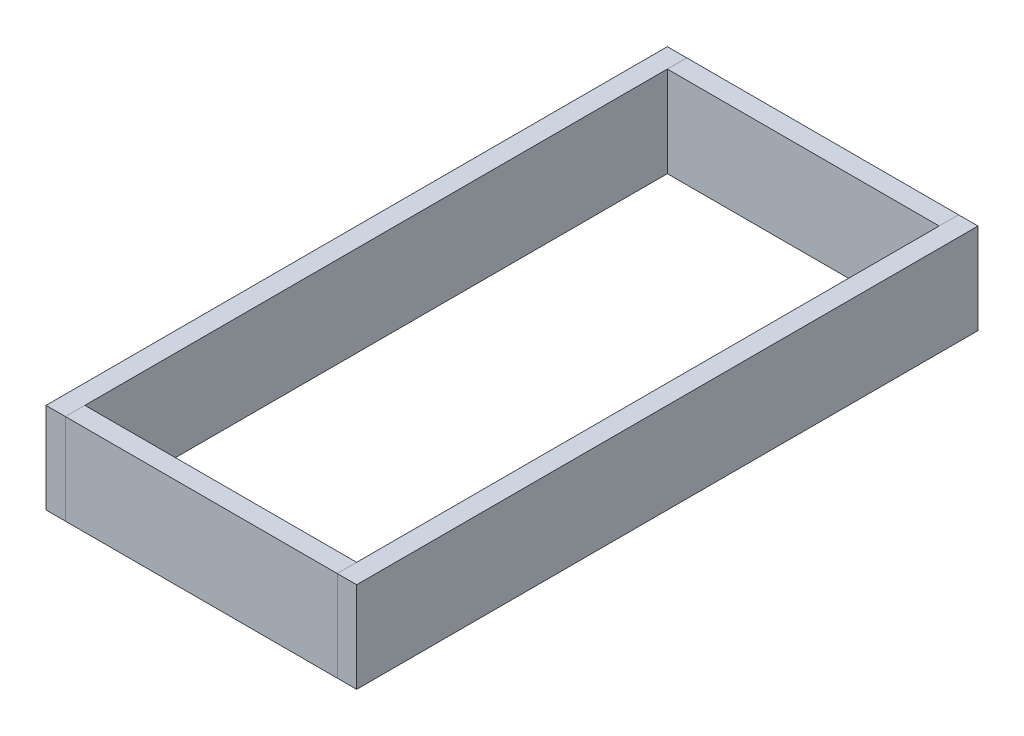
ISO-10303-21;
HEADER;
FILE_DESCRIPTION(('STEP AP214'),'2;1');
FILE_NAME('part.step','',(''),(''),'','','');
FILE_SCHEMA(('AUTOMOTIVE_DESIGN { 1 0 10303 214 1 1 1 1 }'));
ENDSEC;
DATA;
#1=APPLICATION_CONTEXT('core data for automotive mechanical design processes');
#2=APPLICATION_PROTOCOL_DEFINITION('international standard','automotive_design',2000,#1);
#3=PRODUCT_CONTEXT('',#1,'mechanical');
#4=PRODUCT('Part','Part','',(#3));
#5=PRODUCT_RELATED_PRODUCT_CATEGORY('part','',(#4));
#6=PRODUCT_DEFINITION_FORMATION('','',#4);
#7=PRODUCT_DEFINITION_CONTEXT('part definition',#1,'design');
#8=PRODUCT_DEFINITION('design','',#6,#7);
#9=PRODUCT_DEFINITION_SHAPE('','',#8);
#10=(LENGTH_UNIT() NAMED_UNIT(*) SI_UNIT(.MILLI.,.METRE.));
#11=(NAMED_UNIT(*) PLANE_ANGLE_UNIT() SI_UNIT($,.RADIAN.));
#12=(NAMED_UNIT(*) SI_UNIT($,.STERADIAN.) SOLID_ANGLE_UNIT());
#13=UNCERTAINTY_MEASURE_WITH_UNIT(LENGTH_MEASURE(1.E-05),#10,'distance_accuracy_value','');
#14=(GEOMETRIC_REPRESENTATION_CONTEXT(3) GLOBAL_UNCERTAINTY_ASSIGNED_CONTEXT((#13)) GLOBAL_UNIT_ASSIGNED_CONTEXT((#10,
#11,#12)) REPRESENTATION_CONTEXT('',''));
#15=CARTESIAN_POINT('',(0.,0.,0.));
#16=DIRECTION('',(0.,0.,1.));
#17=DIRECTION('',(1.,0.,0.));
#18=AXIS2_PLACEMENT_3D('',#15,#16,#17);
#19=CARTESIAN_POINT('',(-133.35,88.9,0.));
#20=DIRECTION('',(1.,0.,0.));
#21=DIRECTION('',(0.,0.,-1.));
#22=AXIS2_PLACEMENT_3D('',#19,#20,#21);
#23=PLANE('',#22);
#24=DIRECTION('',(0.,0.,1.));
#25=VECTOR('',#24,1.);
#26=CARTESIAN_POINT('',(-133.35,0.,0.));
#27=LINE('',#26,#25);
#28=CARTESIAN_POINT('',(-133.35,0.,-304.8));
#29=VERTEX_POINT('',#28);
#30=CARTESIAN_POINT('',(-133.35,0.,-285.75));
#31=VERTEX_POINT('',#30);
#32=EDGE_CURVE('E113',#29,#31,#27,.T.);
#33=ORIENTED_EDGE('',*,*,#32,.T.);
#34=DIRECTION('',(0.,-1.,0.));
#35=VECTOR('',#34,1.);
#36=CARTESIAN_POINT('',(-133.35,88.9,-285.75));
#37=LINE('',#36,#35);
#38=CARTESIAN_POINT('',(-133.35,88.9,-285.75));
#39=VERTEX_POINT('',#38);
#40=EDGE_CURVE('E12',#39,#31,#37,.T.);
#41=ORIENTED_EDGE('',*,*,#40,.F.);
#42=DIRECTION('',(0.,0.,1.));
#43=VECTOR('',#42,1.);
#44=CARTESIAN_POINT('',(-133.35,88.9,0.));
#45=LINE('',#44,#43);
#46=CARTESIAN_POINT('',(-133.35,88.9,-304.8));
#47=VERTEX_POINT('',#46);
#48=EDGE_CURVE('E99',#47,#39,#45,.T.);
#49=ORIENTED_EDGE('',*,*,#48,.F.);
#50=DIRECTION('',(0.,-1.,0.));
#51=VECTOR('',#50,1.);
#52=CARTESIAN_POINT('',(-133.35,88.9,-304.8));
#53=LINE('',#52,#51);
#54=EDGE_CURVE('E66',#47,#29,#53,.T.);
#55=ORIENTED_EDGE('',*,*,#54,.T.);
#56=EDGE_LOOP('',(#33,#41,#49,#55));
#57=FACE_BOUND('',#56,.T.);
#58=ADVANCED_FACE('F50',(#57),#23,.F.);
#59=CARTESIAN_POINT('',(0.,88.9,-285.75));
#60=DIRECTION('',(0.,0.,-1.));
#61=DIRECTION('',(-1.,0.,0.));
#62=AXIS2_PLACEMENT_3D('',#59,#60,#61);
#63=PLANE('',#62);
#64=DIRECTION('',(1.,0.,0.));
#65=VECTOR('',#64,1.);
#66=CARTESIAN_POINT('',(0.,0.,-285.75));
#67=LINE('',#66,#65);
#68=CARTESIAN_POINT('',(133.35,0.,-285.75));
#69=VERTEX_POINT('',#68);
#70=EDGE_CURVE('E104',#31,#69,#67,.T.);
#71=ORIENTED_EDGE('',*,*,#70,.T.);
#72=DIRECTION('',(0.,-1.,0.));
#73=VECTOR('',#72,1.);
#74=CARTESIAN_POINT('',(133.35,88.9,-285.75));
#75=LINE('',#74,#73);
#76=CARTESIAN_POINT('',(133.35,88.9,-285.75));
#77=VERTEX_POINT('',#76);
#78=EDGE_CURVE('E58',#77,#69,#75,.T.);
#79=ORIENTED_EDGE('',*,*,#78,.F.);
#80=DIRECTION('',(1.,0.,0.));
#81=VECTOR('',#80,1.);
#82=CARTESIAN_POINT('',(0.,88.9,-285.75));
#83=LINE('',#82,#81);
#84=EDGE_CURVE('E91',#39,#77,#83,.T.);
#85=ORIENTED_EDGE('',*,*,#84,.F.);
#86=ORIENTED_EDGE('',*,*,#40,.T.);
#87=EDGE_LOOP('',(#71,#79,#85,#86));
#88=FACE_BOUND('',#87,.T.);
#89=ADVANCED_FACE('F103',(#88),#63,.F.);
#90=CARTESIAN_POINT('',(133.35,88.9,0.));
#91=DIRECTION('',(1.,0.,0.));
#92=DIRECTION('',(0.,0.,-1.));
#93=AXIS2_PLACEMENT_3D('',#90,#91,#92);
#94=PLANE('',#93);
#95=DIRECTION('',(0.,0.,1.));
#96=VECTOR('',#95,1.);
#97=CARTESIAN_POINT('',(133.35,0.,0.));
#98=LINE('',#97,#96);
#99=CARTESIAN_POINT('',(133.35,0.,-304.8));
#100=VERTEX_POINT('',#99);
#101=EDGE_CURVE('E116',#100,#69,#98,.T.);
#102=ORIENTED_EDGE('',*,*,#101,.F.);
#103=DIRECTION('',(0.,-1.,0.));
#104=VECTOR('',#103,1.);
#105=CARTESIAN_POINT('',(133.35,88.9,-304.8));
#106=LINE('',#105,#104);
#107=CARTESIAN_POINT('',(133.35,88.9,-304.8));
#108=VERTEX_POINT('',#107);
#109=EDGE_CURVE('E80',#108,#100,#106,.T.);
#110=ORIENTED_EDGE('',*,*,#109,.F.);
#111=DIRECTION('',(0.,0.,1.));
#112=VECTOR('',#111,1.);
#113=CARTESIAN_POINT('',(133.35,88.9,0.));
#114=LINE('',#113,#112);
#115=EDGE_CURVE('E98',#108,#77,#114,.T.);
#116=ORIENTED_EDGE('',*,*,#115,.T.);
#117=ORIENTED_EDGE('',*,*,#78,.T.);
#118=EDGE_LOOP('',(#102,#110,#116,#117));
#119=FACE_BOUND('',#118,.T.);
#120=ADVANCED_FACE('F107',(#119),#94,.T.);
#121=CARTESIAN_POINT('',(0.,88.9,-304.8));
#122=DIRECTION('',(0.,0.,-1.));
#123=DIRECTION('',(-1.,0.,0.));
#124=AXIS2_PLACEMENT_3D('',#121,#122,#123);
#125=PLANE('',#124);
#126=DIRECTION('',(1.,0.,0.));
#127=VECTOR('',#126,1.);
#128=CARTESIAN_POINT('',(0.,0.,-304.8));
#129=LINE('',#128,#127);
#130=EDGE_CURVE('E118',#29,#100,#129,.T.);
#131=ORIENTED_EDGE('',*,*,#130,.F.);
#132=ORIENTED_EDGE('',*,*,#54,.F.);
#133=DIRECTION('',(1.,0.,0.));
#134=VECTOR('',#133,1.);
#135=CARTESIAN_POINT('',(0.,88.9,-304.8));
#136=LINE('',#135,#134);
#137=EDGE_CURVE('E108',#47,#108,#136,.T.);
#138=ORIENTED_EDGE('',*,*,#137,.T.);
#139=ORIENTED_EDGE('',*,*,#109,.T.);
#140=EDGE_LOOP('',(#131,#132,#138,#139));
#141=FACE_BOUND('',#140,.T.);
#142=ADVANCED_FACE('F124',(#141),#125,.T.);
#143=CARTESIAN_POINT('',(0.,88.9,0.));
#144=DIRECTION('',(0.,1.,0.));
#145=DIRECTION('',(0.,0.,1.));
#146=AXIS2_PLACEMENT_3D('',#143,#144,#145);
#147=PLANE('',#146);
#148=ORIENTED_EDGE('',*,*,#48,.T.);
#149=ORIENTED_EDGE('',*,*,#84,.T.);
#150=ORIENTED_EDGE('',*,*,#115,.F.);
#151=ORIENTED_EDGE('',*,*,#137,.F.);
#152=EDGE_LOOP('',(#148,#149,#150,#151));
#153=FACE_BOUND('',#152,.T.);
#154=ADVANCED_FACE('F95',(#153),#147,.T.);
#155=CARTESIAN_POINT('',(0.,0.,0.));
#156=DIRECTION('',(0.,1.,0.));
#157=DIRECTION('',(0.,0.,1.));
#158=AXIS2_PLACEMENT_3D('',#155,#156,#157);
#159=PLANE('',#158);
#160=ORIENTED_EDGE('',*,*,#32,.F.);
#161=ORIENTED_EDGE('',*,*,#130,.T.);
#162=ORIENTED_EDGE('',*,*,#101,.T.);
#163=ORIENTED_EDGE('',*,*,#70,.F.);
#164=EDGE_LOOP('',(#160,#161,#162,#163));
#165=FACE_BOUND('',#164,.T.);
#166=ADVANCED_FACE('F123',(#165),#159,.F.);
#167=CLOSED_SHELL('',(#58,#89,#120,#142,#154,#166));
#168=MANIFOLD_SOLID_BREP('B2',#167);
#169=CARTESIAN_POINT('',(0.,88.9,285.75));
#170=DIRECTION('',(0.,0.,-1.));
#171=DIRECTION('',(-1.,0.,0.));
#172=AXIS2_PLACEMENT_3D('',#169,#170,#171);
#173=PLANE('',#172);
#174=DIRECTION('',(1.,0.,0.));
#175=VECTOR('',#174,1.);
#176=CARTESIAN_POINT('',(0.,0.,285.75));
#177=LINE('',#176,#175);
#178=CARTESIAN_POINT('',(-133.35,0.,285.75));
#179=VERTEX_POINT('',#178);
#180=CARTESIAN_POINT('',(133.35,0.,285.75));
#181=VERTEX_POINT('',#180);
#182=EDGE_CURVE('E247',#179,#181,#177,.T.);
#183=ORIENTED_EDGE('',*,*,#182,.F.);
#184=DIRECTION('',(0.,-1.,0.));
#185=VECTOR('',#184,1.);
#186=CARTESIAN_POINT('',(-133.35,88.9,285.75));
#187=LINE('',#186,#185);
#188=CARTESIAN_POINT('',(-133.35,88.9,285.75));
#189=VERTEX_POINT('',#188);
#190=EDGE_CURVE('E48',#189,#179,#187,.T.);
#191=ORIENTED_EDGE('',*,*,#190,.F.);
#192=DIRECTION('',(1.,0.,0.));
#193=VECTOR('',#192,1.);
#194=CARTESIAN_POINT('',(0.,88.9,285.75));
#195=LINE('',#194,#193);
#196=CARTESIAN_POINT('',(133.35,88.9,285.75));
#197=VERTEX_POINT('',#196);
#198=EDGE_CURVE('E232',#189,#197,#195,.T.);
#199=ORIENTED_EDGE('',*,*,#198,.T.);
#200=DIRECTION('',(0.,-1.,0.));
#201=VECTOR('',#200,1.);
#202=CARTESIAN_POINT('',(133.35,88.9,285.75));
#203=LINE('',#202,#201);
#204=EDGE_CURVE('E200',#197,#181,#203,.T.);
#205=ORIENTED_EDGE('',*,*,#204,.T.);
#206=EDGE_LOOP('',(#183,#191,#199,#205));
#207=FACE_BOUND('',#206,.T.);
#208=ADVANCED_FACE('F184',(#207),#173,.T.);
#209=CARTESIAN_POINT('',(-133.35,88.9,0.));
#210=DIRECTION('',(1.,0.,0.));
#211=DIRECTION('',(0.,0.,-1.));
#212=AXIS2_PLACEMENT_3D('',#209,#210,#211);
#213=PLANE('',#212);
#214=DIRECTION('',(0.,0.,1.));
#215=VECTOR('',#214,1.);
#216=CARTESIAN_POINT('',(-133.35,0.,0.));
#217=LINE('',#216,#215);
#218=CARTESIAN_POINT('',(-133.35,0.,304.8));
#219=VERTEX_POINT('',#218);
#220=EDGE_CURVE('E238',#179,#219,#217,.T.);
#221=ORIENTED_EDGE('',*,*,#220,.T.);
#222=DIRECTION('',(0.,-1.,0.));
#223=VECTOR('',#222,1.);
#224=CARTESIAN_POINT('',(-133.35,88.9,304.8));
#225=LINE('',#224,#223);
#226=CARTESIAN_POINT('',(-133.35,88.9,304.8));
#227=VERTEX_POINT('',#226);
#228=EDGE_CURVE('E192',#227,#219,#225,.T.);
#229=ORIENTED_EDGE('',*,*,#228,.F.);
#230=DIRECTION('',(0.,0.,1.));
#231=VECTOR('',#230,1.);
#232=CARTESIAN_POINT('',(-133.35,88.9,0.));
#233=LINE('',#232,#231);
#234=EDGE_CURVE('E226',#189,#227,#233,.T.);
#235=ORIENTED_EDGE('',*,*,#234,.F.);
#236=ORIENTED_EDGE('',*,*,#190,.T.);
#237=EDGE_LOOP('',(#221,#229,#235,#236));
#238=FACE_BOUND('',#237,.T.);
#239=ADVANCED_FACE('F236',(#238),#213,.F.);
#240=CARTESIAN_POINT('',(0.,88.9,304.8));
#241=DIRECTION('',(0.,0.,-1.));
#242=DIRECTION('',(-1.,0.,0.));
#243=AXIS2_PLACEMENT_3D('',#240,#241,#242);
#244=PLANE('',#243);
#245=DIRECTION('',(1.,0.,0.));
#246=VECTOR('',#245,1.);
#247=CARTESIAN_POINT('',(0.,0.,304.8));
#248=LINE('',#247,#246);
#249=CARTESIAN_POINT('',(133.35,0.,304.8));
#250=VERTEX_POINT('',#249);
#251=EDGE_CURVE('E250',#219,#250,#248,.T.);
#252=ORIENTED_EDGE('',*,*,#251,.T.);
#253=DIRECTION('',(0.,-1.,0.));
#254=VECTOR('',#253,1.);
#255=CARTESIAN_POINT('',(133.35,88.9,304.8));
#256=LINE('',#255,#254);
#257=CARTESIAN_POINT('',(133.35,88.9,304.8));
#258=VERTEX_POINT('',#257);
#259=EDGE_CURVE('E214',#258,#250,#256,.T.);
#260=ORIENTED_EDGE('',*,*,#259,.F.);
#261=DIRECTION('',(1.,0.,0.));
#262=VECTOR('',#261,1.);
#263=CARTESIAN_POINT('',(0.,88.9,304.8));
#264=LINE('',#263,#262);
#265=EDGE_CURVE('E231',#227,#258,#264,.T.);
#266=ORIENTED_EDGE('',*,*,#265,.F.);
#267=ORIENTED_EDGE('',*,*,#228,.T.);
#268=EDGE_LOOP('',(#252,#260,#266,#267));
#269=FACE_BOUND('',#268,.T.);
#270=ADVANCED_FACE('F241',(#269),#244,.F.);
#271=CARTESIAN_POINT('',(133.35,88.9,0.));
#272=DIRECTION('',(1.,0.,0.));
#273=DIRECTION('',(0.,0.,-1.));
#274=AXIS2_PLACEMENT_3D('',#271,#272,#273);
#275=PLANE('',#274);
#276=DIRECTION('',(0.,0.,1.));
#277=VECTOR('',#276,1.);
#278=CARTESIAN_POINT('',(133.35,0.,0.));
#279=LINE('',#278,#277);
#280=EDGE_CURVE('E252',#181,#250,#279,.T.);
#281=ORIENTED_EDGE('',*,*,#280,.F.);
#282=ORIENTED_EDGE('',*,*,#204,.F.);
#283=DIRECTION('',(0.,0.,1.));
#284=VECTOR('',#283,1.);
#285=CARTESIAN_POINT('',(133.35,88.9,0.));
#286=LINE('',#285,#284);
#287=EDGE_CURVE('E242',#197,#258,#286,.T.);
#288=ORIENTED_EDGE('',*,*,#287,.T.);
#289=ORIENTED_EDGE('',*,*,#259,.T.);
#290=EDGE_LOOP('',(#281,#282,#288,#289));
#291=FACE_BOUND('',#290,.T.);
#292=ADVANCED_FACE('F257',(#291),#275,.T.);
#293=CARTESIAN_POINT('',(0.,88.9,0.));
#294=DIRECTION('',(0.,1.,0.));
#295=DIRECTION('',(0.,0.,1.));
#296=AXIS2_PLACEMENT_3D('',#293,#294,#295);
#297=PLANE('',#296);
#298=ORIENTED_EDGE('',*,*,#198,.F.);
#299=ORIENTED_EDGE('',*,*,#234,.T.);
#300=ORIENTED_EDGE('',*,*,#265,.T.);
#301=ORIENTED_EDGE('',*,*,#287,.F.);
#302=EDGE_LOOP('',(#298,#299,#300,#301));
#303=FACE_BOUND('',#302,.T.);
#304=ADVANCED_FACE('F228',(#303),#297,.T.);
#305=CARTESIAN_POINT('',(0.,0.,0.));
#306=DIRECTION('',(0.,1.,0.));
#307=DIRECTION('',(0.,0.,1.));
#308=AXIS2_PLACEMENT_3D('',#305,#306,#307);
#309=PLANE('',#308);
#310=ORIENTED_EDGE('',*,*,#182,.T.);
#311=ORIENTED_EDGE('',*,*,#280,.T.);
#312=ORIENTED_EDGE('',*,*,#251,.F.);
#313=ORIENTED_EDGE('',*,*,#220,.F.);
#314=EDGE_LOOP('',(#310,#311,#312,#313));
#315=FACE_BOUND('',#314,.T.);
#316=ADVANCED_FACE('F264',(#315),#309,.F.);
#317=CLOSED_SHELL('',(#208,#239,#270,#292,#304,#316));
#318=MANIFOLD_SOLID_BREP('B6',#317);
#319=CARTESIAN_POINT('',(0.,88.9,-304.8));
#320=DIRECTION('',(0.,0.,-1.));
#321=DIRECTION('',(-1.,0.,0.));
#322=AXIS2_PLACEMENT_3D('',#319,#320,#321);
#323=PLANE('',#322);
#324=DIRECTION('',(1.,0.,0.));
#325=VECTOR('',#324,1.);
#326=CARTESIAN_POINT('',(0.,0.,-304.8));
#327=LINE('',#326,#325);
#328=CARTESIAN_POINT('',(133.35,0.,-304.8));
#329=VERTEX_POINT('',#328);
#330=CARTESIAN_POINT('',(152.4,0.,-304.8));
#331=VERTEX_POINT('',#330);
#332=EDGE_CURVE('E380',#329,#331,#327,.T.);
#333=ORIENTED_EDGE('',*,*,#332,.F.);
#334=DIRECTION('',(0.,-1.,0.));
#335=VECTOR('',#334,1.);
#336=CARTESIAN_POINT('',(133.35,88.9,-304.8));
#337=LINE('',#336,#335);
#338=CARTESIAN_POINT('',(133.35,88.9,-304.8));
#339=VERTEX_POINT('',#338);
#340=EDGE_CURVE('E182',#339,#329,#337,.T.);
#341=ORIENTED_EDGE('',*,*,#340,.F.);
#342=DIRECTION('',(1.,0.,0.));
#343=VECTOR('',#342,1.);
#344=CARTESIAN_POINT('',(0.,88.9,-304.8));
#345=LINE('',#344,#343);
#346=CARTESIAN_POINT('',(152.4,88.9,-304.8));
#347=VERTEX_POINT('',#346);
#348=EDGE_CURVE('E365',#339,#347,#345,.T.);
#349=ORIENTED_EDGE('',*,*,#348,.T.);
#350=DIRECTION('',(0.,-1.,0.));
#351=VECTOR('',#350,1.);
#352=CARTESIAN_POINT('',(152.4,88.9,-304.8));
#353=LINE('',#352,#351);
#354=EDGE_CURVE('E333',#347,#331,#353,.T.);
#355=ORIENTED_EDGE('',*,*,#354,.T.);
#356=EDGE_LOOP('',(#333,#341,#349,#355));
#357=FACE_BOUND('',#356,.T.);
#358=ADVANCED_FACE('F317',(#357),#323,.T.);
#359=CARTESIAN_POINT('',(133.35,88.9,0.));
#360=DIRECTION('',(1.,0.,0.));
#361=DIRECTION('',(0.,0.,-1.));
#362=AXIS2_PLACEMENT_3D('',#359,#360,#361);
#363=PLANE('',#362);
#364=DIRECTION('',(0.,0.,1.));
#365=VECTOR('',#364,1.);
#366=CARTESIAN_POINT('',(133.35,0.,0.));
#367=LINE('',#366,#365);
#368=CARTESIAN_POINT('',(133.35,0.,304.8));
#369=VERTEX_POINT('',#368);
#370=EDGE_CURVE('E371',#329,#369,#367,.T.);
#371=ORIENTED_EDGE('',*,*,#370,.T.);
#372=DIRECTION('',(0.,-1.,0.));
#373=VECTOR('',#372,1.);
#374=CARTESIAN_POINT('',(133.35,88.9,304.8));
#375=LINE('',#374,#373);
#376=CARTESIAN_POINT('',(133.35,88.9,304.8));
#377=VERTEX_POINT('',#376);
#378=EDGE_CURVE('E325',#377,#369,#375,.T.);
#379=ORIENTED_EDGE('',*,*,#378,.F.);
#380=DIRECTION('',(0.,0.,1.));
#381=VECTOR('',#380,1.);
#382=CARTESIAN_POINT('',(133.35,88.9,0.));
#383=LINE('',#382,#381);
#384=EDGE_CURVE('E359',#339,#377,#383,.T.);
#385=ORIENTED_EDGE('',*,*,#384,.F.);
#386=ORIENTED_EDGE('',*,*,#340,.T.);
#387=EDGE_LOOP('',(#371,#379,#385,#386));
#388=FACE_BOUND('',#387,.T.);
#389=ADVANCED_FACE('F369',(#388),#363,.F.);
#390=CARTESIAN_POINT('',(0.,88.9,304.8));
#391=DIRECTION('',(0.,0.,-1.));
#392=DIRECTION('',(-1.,0.,0.));
#393=AXIS2_PLACEMENT_3D('',#390,#391,#392);
#394=PLANE('',#393);
#395=DIRECTION('',(1.,0.,0.));
#396=VECTOR('',#395,1.);
#397=CARTESIAN_POINT('',(0.,0.,304.8));
#398=LINE('',#397,#396);
#399=CARTESIAN_POINT('',(152.4,0.,304.8));
#400=VERTEX_POINT('',#399);
#401=EDGE_CURVE('E383',#369,#400,#398,.T.);
#402=ORIENTED_EDGE('',*,*,#401,.T.);
#403=DIRECTION('',(0.,-1.,0.));
#404=VECTOR('',#403,1.);
#405=CARTESIAN_POINT('',(152.4,88.9,304.8));
#406=LINE('',#405,#404);
#407=CARTESIAN_POINT('',(152.4,88.9,304.8));
#408=VERTEX_POINT('',#407);
#409=EDGE_CURVE('E347',#408,#400,#406,.T.);
#410=ORIENTED_EDGE('',*,*,#409,.F.);
#411=DIRECTION('',(1.,0.,0.));
#412=VECTOR('',#411,1.);
#413=CARTESIAN_POINT('',(0.,88.9,304.8));
#414=LINE('',#413,#412);
#415=EDGE_CURVE('E364',#377,#408,#414,.T.);
#416=ORIENTED_EDGE('',*,*,#415,.F.);
#417=ORIENTED_EDGE('',*,*,#378,.T.);
#418=EDGE_LOOP('',(#402,#410,#416,#417));
#419=FACE_BOUND('',#418,.T.);
#420=ADVANCED_FACE('F374',(#419),#394,.F.);
#421=CARTESIAN_POINT('',(152.4,88.9,0.));
#422=DIRECTION('',(1.,0.,0.));
#423=DIRECTION('',(0.,0.,-1.));
#424=AXIS2_PLACEMENT_3D('',#421,#422,#423);
#425=PLANE('',#424);
#426=DIRECTION('',(0.,0.,1.));
#427=VECTOR('',#426,1.);
#428=CARTESIAN_POINT('',(152.4,0.,0.));
#429=LINE('',#428,#427);
#430=EDGE_CURVE('E385',#331,#400,#429,.T.);
#431=ORIENTED_EDGE('',*,*,#430,.F.);
#432=ORIENTED_EDGE('',*,*,#354,.F.);
#433=DIRECTION('',(0.,0.,1.));
#434=VECTOR('',#433,1.);
#435=CARTESIAN_POINT('',(152.4,88.9,0.));
#436=LINE('',#435,#434);
#437=EDGE_CURVE('E375',#347,#408,#436,.T.);
#438=ORIENTED_EDGE('',*,*,#437,.T.);
#439=ORIENTED_EDGE('',*,*,#409,.T.);
#440=EDGE_LOOP('',(#431,#432,#438,#439));
#441=FACE_BOUND('',#440,.T.);
#442=ADVANCED_FACE('F390',(#441),#425,.T.);
#443=CARTESIAN_POINT('',(0.,88.9,0.));
#444=DIRECTION('',(0.,1.,0.));
#445=DIRECTION('',(0.,0.,1.));
#446=AXIS2_PLACEMENT_3D('',#443,#444,#445);
#447=PLANE('',#446);
#448=ORIENTED_EDGE('',*,*,#348,.F.);
#449=ORIENTED_EDGE('',*,*,#384,.T.);
#450=ORIENTED_EDGE('',*,*,#415,.T.);
#451=ORIENTED_EDGE('',*,*,#437,.F.);
#452=EDGE_LOOP('',(#448,#449,#450,#451));
#453=FACE_BOUND('',#452,.T.);
#454=ADVANCED_FACE('F361',(#453),#447,.T.);
#455=CARTESIAN_POINT('',(0.,0.,0.));
#456=DIRECTION('',(0.,1.,0.));
#457=DIRECTION('',(0.,0.,1.));
#458=AXIS2_PLACEMENT_3D('',#455,#456,#457);
#459=PLANE('',#458);
#460=ORIENTED_EDGE('',*,*,#332,.T.);
#461=ORIENTED_EDGE('',*,*,#430,.T.);
#462=ORIENTED_EDGE('',*,*,#401,.F.);
#463=ORIENTED_EDGE('',*,*,#370,.F.);
#464=EDGE_LOOP('',(#460,#461,#462,#463));
#465=FACE_BOUND('',#464,.T.);
#466=ADVANCED_FACE('F397',(#465),#459,.F.);
#467=CLOSED_SHELL('',(#358,#389,#420,#442,#454,#466));
#468=MANIFOLD_SOLID_BREP('B42',#467);
#469=CARTESIAN_POINT('',(-133.35,88.9,0.));
#470=DIRECTION('',(1.,0.,0.));
#471=DIRECTION('',(0.,0.,-1.));
#472=AXIS2_PLACEMENT_3D('',#469,#470,#471);
#473=PLANE('',#472);
#474=DIRECTION('',(0.,0.,1.));
#475=VECTOR('',#474,1.);
#476=CARTESIAN_POINT('',(-133.35,0.,0.));
#477=LINE('',#476,#475);
#478=CARTESIAN_POINT('',(-133.35,0.,-304.8));
#479=VERTEX_POINT('',#478);
#480=CARTESIAN_POINT('',(-133.35,0.,304.8));
#481=VERTEX_POINT('',#480);
#482=EDGE_CURVE('E504',#479,#481,#477,.T.);
#483=ORIENTED_EDGE('',*,*,#482,.F.);
#484=DIRECTION('',(0.,-1.,0.));
#485=VECTOR('',#484,1.);
#486=CARTESIAN_POINT('',(-133.35,88.9,-304.8));
#487=LINE('',#486,#485);
#488=CARTESIAN_POINT('',(-133.35,88.9,-304.8));
#489=VERTEX_POINT('',#488);
#490=EDGE_CURVE('E315',#489,#479,#487,.T.);
#491=ORIENTED_EDGE('',*,*,#490,.F.);
#492=DIRECTION('',(0.,0.,1.));
#493=VECTOR('',#492,1.);
#494=CARTESIAN_POINT('',(-133.35,88.9,0.));
#495=LINE('',#494,#493);
#496=CARTESIAN_POINT('',(-133.35,88.9,304.8));
#497=VERTEX_POINT('',#496);
#498=EDGE_CURVE('E498',#489,#497,#495,.T.);
#499=ORIENTED_EDGE('',*,*,#498,.T.);
#500=DIRECTION('',(0.,-1.,0.));
#501=VECTOR('',#500,1.);
#502=CARTESIAN_POINT('',(-133.35,88.9,304.8));
#503=LINE('',#502,#501);
#504=EDGE_CURVE('E479',#497,#481,#503,.T.);
#505=ORIENTED_EDGE('',*,*,#504,.T.);
#506=EDGE_LOOP('',(#483,#491,#499,#505));
#507=FACE_BOUND('',#506,.T.);
#508=ADVANCED_FACE('F441',(#507),#473,.T.);
#509=CARTESIAN_POINT('',(0.,88.9,-304.8));
#510=DIRECTION('',(0.,0.,-1.));
#511=DIRECTION('',(-1.,0.,0.));
#512=AXIS2_PLACEMENT_3D('',#509,#510,#511);
#513=PLANE('',#512);
#514=DIRECTION('',(1.,0.,0.));
#515=VECTOR('',#514,1.);
#516=CARTESIAN_POINT('',(0.,0.,-304.8));
#517=LINE('',#516,#515);
#518=CARTESIAN_POINT('',(-152.4,0.,-304.8));
#519=VERTEX_POINT('',#518);
#520=EDGE_CURVE('E492',#519,#479,#517,.T.);
#521=ORIENTED_EDGE('',*,*,#520,.F.);
#522=DIRECTION('',(0.,-1.,0.));
#523=VECTOR('',#522,1.);
#524=CARTESIAN_POINT('',(-152.4,88.9,-304.8));
#525=LINE('',#524,#523);
#526=CARTESIAN_POINT('',(-152.4,88.9,-304.8));
#527=VERTEX_POINT('',#526);
#528=EDGE_CURVE('E449',#527,#519,#525,.T.);
#529=ORIENTED_EDGE('',*,*,#528,.F.);
#530=DIRECTION('',(1.,0.,0.));
#531=VECTOR('',#530,1.);
#532=CARTESIAN_POINT('',(0.,88.9,-304.8));
#533=LINE('',#532,#531);
#534=EDGE_CURVE('E490',#527,#489,#533,.T.);
#535=ORIENTED_EDGE('',*,*,#534,.T.);
#536=ORIENTED_EDGE('',*,*,#490,.T.);
#537=EDGE_LOOP('',(#521,#529,#535,#536));
#538=FACE_BOUND('',#537,.T.);
#539=ADVANCED_FACE('F488',(#538),#513,.T.);
#540=CARTESIAN_POINT('',(-152.4,88.9,0.));
#541=DIRECTION('',(1.,0.,0.));
#542=DIRECTION('',(0.,0.,-1.));
#543=AXIS2_PLACEMENT_3D('',#540,#541,#542);
#544=PLANE('',#543);
#545=DIRECTION('',(0.,0.,1.));
#546=VECTOR('',#545,1.);
#547=CARTESIAN_POINT('',(-152.4,0.,0.));
#548=LINE('',#547,#546);
#549=CARTESIAN_POINT('',(-152.4,0.,304.8));
#550=VERTEX_POINT('',#549);
#551=EDGE_CURVE('E472',#519,#550,#548,.T.);
#552=ORIENTED_EDGE('',*,*,#551,.T.);
#553=DIRECTION('',(0.,-1.,0.));
#554=VECTOR('',#553,1.);
#555=CARTESIAN_POINT('',(-152.4,88.9,304.8));
#556=LINE('',#555,#554);
#557=CARTESIAN_POINT('',(-152.4,88.9,304.8));
#558=VERTEX_POINT('',#557);
#559=EDGE_CURVE('E493',#558,#550,#556,.T.);
#560=ORIENTED_EDGE('',*,*,#559,.F.);
#561=DIRECTION('',(0.,0.,1.));
#562=VECTOR('',#561,1.);
#563=CARTESIAN_POINT('',(-152.4,88.9,0.));
#564=LINE('',#563,#562);
#565=EDGE_CURVE('E494',#527,#558,#564,.T.);
#566=ORIENTED_EDGE('',*,*,#565,.F.);
#567=ORIENTED_EDGE('',*,*,#528,.T.);
#568=EDGE_LOOP('',(#552,#560,#566,#567));
#569=FACE_BOUND('',#568,.T.);
#570=ADVANCED_FACE('F495',(#569),#544,.F.);
#571=CARTESIAN_POINT('',(0.,88.9,304.8));
#572=DIRECTION('',(0.,0.,-1.));
#573=DIRECTION('',(-1.,0.,0.));
#574=AXIS2_PLACEMENT_3D('',#571,#572,#573);
#575=PLANE('',#574);
#576=DIRECTION('',(1.,0.,0.));
#577=VECTOR('',#576,1.);
#578=CARTESIAN_POINT('',(0.,0.,304.8));
#579=LINE('',#578,#577);
#580=EDGE_CURVE('E500',#550,#481,#579,.T.);
#581=ORIENTED_EDGE('',*,*,#580,.T.);
#582=ORIENTED_EDGE('',*,*,#504,.F.);
#583=DIRECTION('',(1.,0.,0.));
#584=VECTOR('',#583,1.);
#585=CARTESIAN_POINT('',(0.,88.9,304.8));
#586=LINE('',#585,#584);
#587=EDGE_CURVE('E457',#558,#497,#586,.T.);
#588=ORIENTED_EDGE('',*,*,#587,.F.);
#589=ORIENTED_EDGE('',*,*,#559,.T.);
#590=EDGE_LOOP('',(#581,#582,#588,#589));
#591=FACE_BOUND('',#590,.T.);
#592=ADVANCED_FACE('F513',(#591),#575,.F.);
#593=CARTESIAN_POINT('',(0.,88.9,0.));
#594=DIRECTION('',(0.,1.,0.));
#595=DIRECTION('',(0.,0.,1.));
#596=AXIS2_PLACEMENT_3D('',#593,#594,#595);
#597=PLANE('',#596);
#598=ORIENTED_EDGE('',*,*,#498,.F.);
#599=ORIENTED_EDGE('',*,*,#534,.F.);
#600=ORIENTED_EDGE('',*,*,#565,.T.);
#601=ORIENTED_EDGE('',*,*,#587,.T.);
#602=EDGE_LOOP('',(#598,#599,#600,#601));
#603=FACE_BOUND('',#602,.T.);
#604=ADVANCED_FACE('F497',(#603),#597,.T.);
#605=CARTESIAN_POINT('',(0.,0.,0.));
#606=DIRECTION('',(0.,1.,0.));
#607=DIRECTION('',(0.,0.,1.));
#608=AXIS2_PLACEMENT_3D('',#605,#606,#607);
#609=PLANE('',#608);
#610=ORIENTED_EDGE('',*,*,#482,.T.);
#611=ORIENTED_EDGE('',*,*,#580,.F.);
#612=ORIENTED_EDGE('',*,*,#551,.F.);
#613=ORIENTED_EDGE('',*,*,#520,.T.);
#614=EDGE_LOOP('',(#610,#611,#612,#613));
#615=FACE_BOUND('',#614,.T.);
#616=ADVANCED_FACE('F515',(#615),#609,.F.);
#617=CLOSED_SHELL('',(#508,#539,#570,#592,#604,#616));
#618=MANIFOLD_SOLID_BREP('B176',#617);
#619=ADVANCED_BREP_SHAPE_REPRESENTATION('',(#18,#168,#318,#468,#618),#14);
#620=SHAPE_DEFINITION_REPRESENTATION(#9,#619);
ENDSEC;
END-ISO-10303-21;
